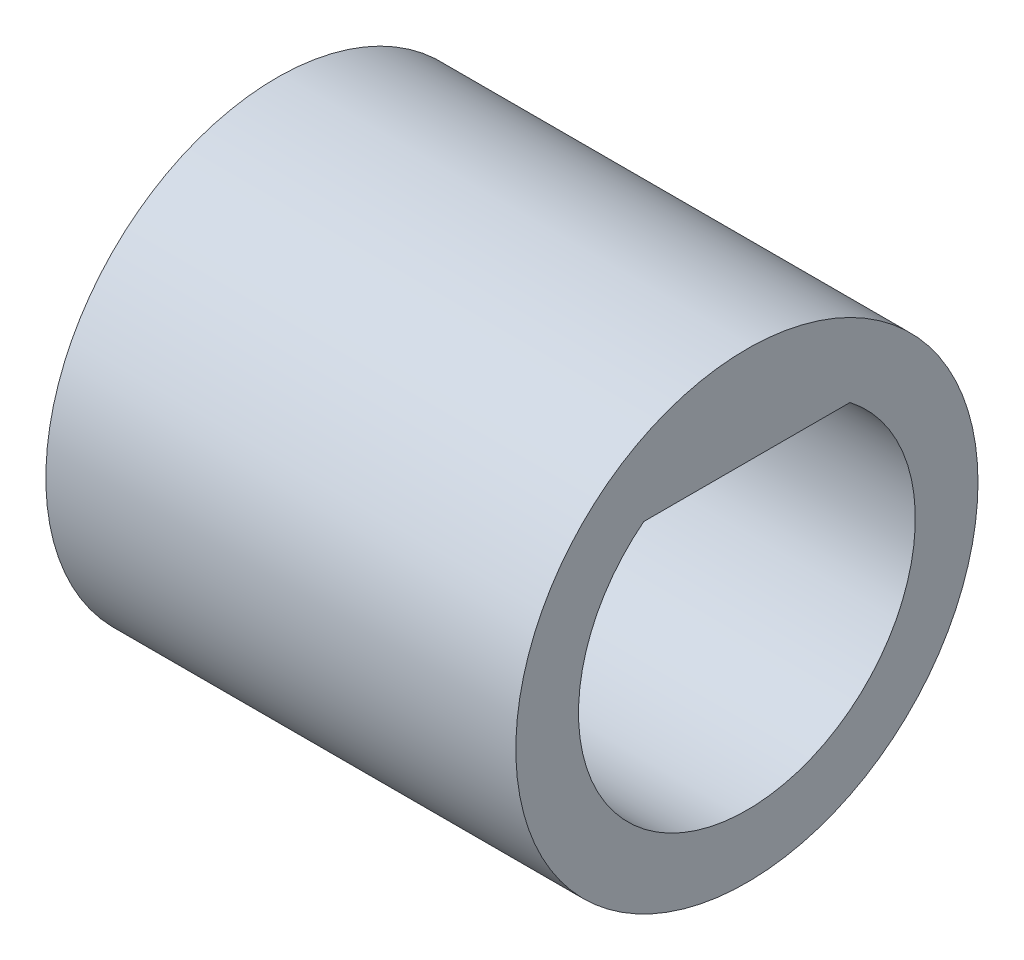
ISO-10303-21;
HEADER;
FILE_DESCRIPTION(('STEP AP214'),'2;1');
FILE_NAME('part.step','',(''),(''),'','','');
FILE_SCHEMA(('AUTOMOTIVE_DESIGN { 1 0 10303 214 1 1 1 1 }'));
ENDSEC;
DATA;
#1=APPLICATION_CONTEXT('core data for automotive mechanical design processes');
#2=APPLICATION_PROTOCOL_DEFINITION('international standard','automotive_design',2000,#1);
#3=PRODUCT_CONTEXT('',#1,'mechanical');
#4=PRODUCT('Part','Part','',(#3));
#5=PRODUCT_RELATED_PRODUCT_CATEGORY('part','',(#4));
#6=PRODUCT_DEFINITION_FORMATION('','',#4);
#7=PRODUCT_DEFINITION_CONTEXT('part definition',#1,'design');
#8=PRODUCT_DEFINITION('design','',#6,#7);
#9=PRODUCT_DEFINITION_SHAPE('','',#8);
#10=(LENGTH_UNIT() NAMED_UNIT(*) SI_UNIT(.MILLI.,.METRE.));
#11=(NAMED_UNIT(*) PLANE_ANGLE_UNIT() SI_UNIT($,.RADIAN.));
#12=(NAMED_UNIT(*) SI_UNIT($,.STERADIAN.) SOLID_ANGLE_UNIT());
#13=UNCERTAINTY_MEASURE_WITH_UNIT(LENGTH_MEASURE(1.E-05),#10,'distance_accuracy_value','');
#14=(GEOMETRIC_REPRESENTATION_CONTEXT(3) GLOBAL_UNCERTAINTY_ASSIGNED_CONTEXT((#13)) GLOBAL_UNIT_ASSIGNED_CONTEXT((#10,
#11,#12)) REPRESENTATION_CONTEXT('',''));
#15=CARTESIAN_POINT('',(0.,0.,0.));
#16=DIRECTION('',(0.,0.,1.));
#17=DIRECTION('',(1.,0.,0.));
#18=AXIS2_PLACEMENT_3D('',#15,#16,#17);
#19=CARTESIAN_POINT('',(6.,0.,0.));
#20=DIRECTION('',(-1.,0.,0.));
#21=DIRECTION('',(0.,0.,1.));
#22=AXIS2_PLACEMENT_3D('',#19,#20,#21);
#23=CYLINDRICAL_SURFACE('',#22,2.95);
#24=CARTESIAN_POINT('',(6.,0.,0.));
#25=DIRECTION('',(1.,0.,0.));
#26=DIRECTION('',(0.,0.,-1.));
#27=AXIS2_PLACEMENT_3D('',#24,#25,#26);
#28=CIRCLE('',#27,2.95);
#29=CARTESIAN_POINT('',(6.,0.,-2.95));
#30=VERTEX_POINT('',#29);
#31=EDGE_CURVE('E11',#30,#30,#28,.T.);
#32=ORIENTED_EDGE('',*,*,#31,.F.);
#33=EDGE_LOOP('',(#32));
#34=FACE_BOUND('',#33,.T.);
#35=CARTESIAN_POINT('',(0.,0.,0.));
#36=DIRECTION('',(1.,0.,0.));
#37=DIRECTION('',(0.,0.,-1.));
#38=AXIS2_PLACEMENT_3D('',#35,#36,#37);
#39=CIRCLE('',#38,2.95);
#40=CARTESIAN_POINT('',(0.,0.,-2.95));
#41=VERTEX_POINT('',#40);
#42=EDGE_CURVE('E38',#41,#41,#39,.T.);
#43=ORIENTED_EDGE('',*,*,#42,.T.);
#44=EDGE_LOOP('',(#43));
#45=FACE_BOUND('',#44,.T.);
#46=ADVANCED_FACE('F35',(#34,#45),#23,.T.);
#47=CARTESIAN_POINT('',(6.,0.,0.));
#48=DIRECTION('',(1.,0.,0.));
#49=DIRECTION('',(0.,0.,-1.));
#50=AXIS2_PLACEMENT_3D('',#47,#48,#49);
#51=PLANE('',#50);
#52=CARTESIAN_POINT('',(6.,0.,0.));
#53=DIRECTION('',(1.,0.,0.));
#54=DIRECTION('',(0.,0.,-1.));
#55=AXIS2_PLACEMENT_3D('',#52,#53,#54);
#56=CIRCLE('',#55,2.15);
#57=CARTESIAN_POINT('',(6.,1.7,1.31624465810882));
#58=VERTEX_POINT('',#57);
#59=CARTESIAN_POINT('',(6.,1.7,-1.31624465810882));
#60=VERTEX_POINT('',#59);
#61=EDGE_CURVE('E49',#58,#60,#56,.T.);
#62=ORIENTED_EDGE('',*,*,#61,.F.);
#63=DIRECTION('',(0.,0.,1.));
#64=VECTOR('',#63,1.);
#65=CARTESIAN_POINT('',(6.,1.7,1.31624465810882));
#66=LINE('',#65,#64);
#67=EDGE_CURVE('E68',#60,#58,#66,.T.);
#68=ORIENTED_EDGE('',*,*,#67,.F.);
#69=EDGE_LOOP('',(#62,#68));
#70=FACE_BOUND('',#69,.T.);
#71=ORIENTED_EDGE('',*,*,#31,.T.);
#72=EDGE_LOOP('',(#71));
#73=FACE_BOUND('',#72,.T.);
#74=ADVANCED_FACE('F72',(#70,#73),#51,.T.);
#75=CARTESIAN_POINT('',(0.,0.,0.));
#76=DIRECTION('',(1.,0.,0.));
#77=DIRECTION('',(0.,0.,-1.));
#78=AXIS2_PLACEMENT_3D('',#75,#76,#77);
#79=PLANE('',#78);
#80=ORIENTED_EDGE('',*,*,#42,.F.);
#81=EDGE_LOOP('',(#80));
#82=FACE_BOUND('',#81,.T.);
#83=ADVANCED_FACE('F92',(#82),#79,.F.);
#84=CARTESIAN_POINT('',(1.,0.,0.));
#85=DIRECTION('',(1.,0.,0.));
#86=DIRECTION('',(0.,0.,-1.));
#87=AXIS2_PLACEMENT_3D('',#84,#85,#86);
#88=CYLINDRICAL_SURFACE('',#87,2.15);
#89=ORIENTED_EDGE('',*,*,#61,.T.);
#90=DIRECTION('',(1.,0.,0.));
#91=VECTOR('',#90,1.);
#92=CARTESIAN_POINT('',(1.,1.7,-1.31624465810882));
#93=LINE('',#92,#91);
#94=CARTESIAN_POINT('',(1.,1.7,-1.31624465810882));
#95=VERTEX_POINT('',#94);
#96=EDGE_CURVE('E65',#95,#60,#93,.T.);
#97=ORIENTED_EDGE('',*,*,#96,.F.);
#98=CARTESIAN_POINT('',(1.,0.,0.));
#99=DIRECTION('',(1.,0.,0.));
#100=DIRECTION('',(0.,0.,-1.));
#101=AXIS2_PLACEMENT_3D('',#98,#99,#100);
#102=CIRCLE('',#101,2.15);
#103=CARTESIAN_POINT('',(1.,1.7,1.31624465810882));
#104=VERTEX_POINT('',#103);
#105=EDGE_CURVE('E63',#104,#95,#102,.T.);
#106=ORIENTED_EDGE('',*,*,#105,.F.);
#107=DIRECTION('',(1.,0.,0.));
#108=VECTOR('',#107,1.);
#109=CARTESIAN_POINT('',(1.,1.7,1.31624465810882));
#110=LINE('',#109,#108);
#111=EDGE_CURVE('E57',#104,#58,#110,.T.);
#112=ORIENTED_EDGE('',*,*,#111,.T.);
#113=EDGE_LOOP('',(#89,#97,#106,#112));
#114=FACE_BOUND('',#113,.T.);
#115=ADVANCED_FACE('F61',(#114),#88,.F.);
#116=CARTESIAN_POINT('',(1.,1.7,1.31624465810882));
#117=DIRECTION('',(0.,1.,0.));
#118=DIRECTION('',(0.,0.,1.));
#119=AXIS2_PLACEMENT_3D('',#116,#117,#118);
#120=PLANE('',#119);
#121=ORIENTED_EDGE('',*,*,#67,.T.);
#122=ORIENTED_EDGE('',*,*,#111,.F.);
#123=DIRECTION('',(0.,0.,1.));
#124=VECTOR('',#123,1.);
#125=CARTESIAN_POINT('',(1.,1.7,1.31624465810882));
#126=LINE('',#125,#124);
#127=EDGE_CURVE('E76',#95,#104,#126,.T.);
#128=ORIENTED_EDGE('',*,*,#127,.F.);
#129=ORIENTED_EDGE('',*,*,#96,.T.);
#130=EDGE_LOOP('',(#121,#122,#128,#129));
#131=FACE_BOUND('',#130,.T.);
#132=ADVANCED_FACE('F69',(#131),#120,.F.);
#133=CARTESIAN_POINT('',(1.,0.,0.));
#134=DIRECTION('',(1.,0.,0.));
#135=DIRECTION('',(0.,0.,-1.));
#136=AXIS2_PLACEMENT_3D('',#133,#134,#135);
#137=PLANE('',#136);
#138=ORIENTED_EDGE('',*,*,#105,.T.);
#139=ORIENTED_EDGE('',*,*,#127,.T.);
#140=EDGE_LOOP('',(#138,#139));
#141=FACE_BOUND('',#140,.T.);
#142=ADVANCED_FACE('F80',(#141),#137,.T.);
#143=CLOSED_SHELL('',(#46,#74,#83,#115,#132,#142));
#144=MANIFOLD_SOLID_BREP('B2',#143);
#145=ADVANCED_BREP_SHAPE_REPRESENTATION('',(#18,#144),#14);
#146=SHAPE_DEFINITION_REPRESENTATION(#9,#145);
ENDSEC;
END-ISO-10303-21;
